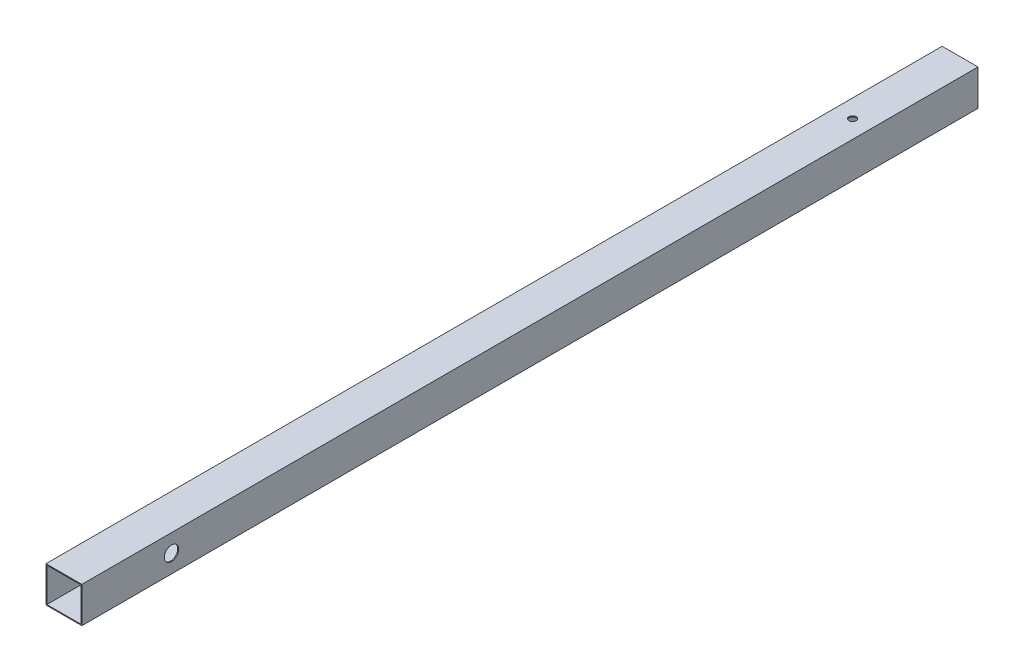
ISO-10303-21;
HEADER;
FILE_DESCRIPTION(('STEP AP214'),'2;1');
FILE_NAME('part.step','',(''),(''),'','','');
FILE_SCHEMA(('AUTOMOTIVE_DESIGN { 1 0 10303 214 1 1 1 1 }'));
ENDSEC;
DATA;
#1=APPLICATION_CONTEXT('core data for automotive mechanical design processes');
#2=APPLICATION_PROTOCOL_DEFINITION('international standard','automotive_design',2000,#1);
#3=PRODUCT_CONTEXT('',#1,'mechanical');
#4=PRODUCT('Part','Part','',(#3));
#5=PRODUCT_RELATED_PRODUCT_CATEGORY('part','',(#4));
#6=PRODUCT_DEFINITION_FORMATION('','',#4);
#7=PRODUCT_DEFINITION_CONTEXT('part definition',#1,'design');
#8=PRODUCT_DEFINITION('design','',#6,#7);
#9=PRODUCT_DEFINITION_SHAPE('','',#8);
#10=(LENGTH_UNIT() NAMED_UNIT(*) SI_UNIT(.MILLI.,.METRE.));
#11=(NAMED_UNIT(*) PLANE_ANGLE_UNIT() SI_UNIT($,.RADIAN.));
#12=(NAMED_UNIT(*) SI_UNIT($,.STERADIAN.) SOLID_ANGLE_UNIT());
#13=UNCERTAINTY_MEASURE_WITH_UNIT(LENGTH_MEASURE(1.E-05),#10,'distance_accuracy_value','');
#14=(GEOMETRIC_REPRESENTATION_CONTEXT(3) GLOBAL_UNCERTAINTY_ASSIGNED_CONTEXT((#13)) GLOBAL_UNIT_ASSIGNED_CONTEXT((#10,
#11,#12)) REPRESENTATION_CONTEXT('',''));
#15=CARTESIAN_POINT('',(0.,0.,0.));
#16=DIRECTION('',(0.,0.,1.));
#17=DIRECTION('',(1.,0.,0.));
#18=AXIS2_PLACEMENT_3D('',#15,#16,#17);
#19=CARTESIAN_POINT('',(10.,10.,500.));
#20=DIRECTION('',(-1.,0.,0.));
#21=DIRECTION('',(0.,-1.,0.));
#22=AXIS2_PLACEMENT_3D('',#19,#20,#21);
#23=PLANE('',#22);
#24=CARTESIAN_POINT('',(10.,0.,450.));
#25=DIRECTION('',(-1.,0.,0.));
#26=DIRECTION('',(0.,0.,1.));
#27=AXIS2_PLACEMENT_3D('',#24,#25,#26);
#28=CIRCLE('',#27,3.99999999999999);
#29=CARTESIAN_POINT('',(10.,0.,454.));
#30=VERTEX_POINT('',#29);
#31=EDGE_CURVE('E182',#30,#30,#28,.T.);
#32=ORIENTED_EDGE('',*,*,#31,.T.);
#33=EDGE_LOOP('',(#32));
#34=FACE_BOUND('',#33,.T.);
#35=DIRECTION('',(0.,1.,0.));
#36=VECTOR('',#35,1.);
#37=CARTESIAN_POINT('',(10.,10.,0.));
#38=LINE('',#37,#36);
#39=CARTESIAN_POINT('',(10.,-10.,0.));
#40=VERTEX_POINT('',#39);
#41=CARTESIAN_POINT('',(10.,10.,0.));
#42=VERTEX_POINT('',#41);
#43=EDGE_CURVE('E135',#40,#42,#38,.T.);
#44=ORIENTED_EDGE('',*,*,#43,.T.);
#45=DIRECTION('',(0.,0.,-1.));
#46=VECTOR('',#45,1.);
#47=CARTESIAN_POINT('',(10.,10.,500.));
#48=LINE('',#47,#46);
#49=CARTESIAN_POINT('',(10.,10.,500.));
#50=VERTEX_POINT('',#49);
#51=EDGE_CURVE('E11',#50,#42,#48,.T.);
#52=ORIENTED_EDGE('',*,*,#51,.F.);
#53=DIRECTION('',(0.,1.,0.));
#54=VECTOR('',#53,1.);
#55=CARTESIAN_POINT('',(10.,10.,500.));
#56=LINE('',#55,#54);
#57=CARTESIAN_POINT('',(10.,-10.,500.));
#58=VERTEX_POINT('',#57);
#59=EDGE_CURVE('E139',#58,#50,#56,.T.);
#60=ORIENTED_EDGE('',*,*,#59,.F.);
#61=DIRECTION('',(0.,0.,-1.));
#62=VECTOR('',#61,1.);
#63=CARTESIAN_POINT('',(10.,-10.,500.));
#64=LINE('',#63,#62);
#65=EDGE_CURVE('E149',#58,#40,#64,.T.);
#66=ORIENTED_EDGE('',*,*,#65,.T.);
#67=EDGE_LOOP('',(#44,#52,#60,#66));
#68=FACE_BOUND('',#67,.T.);
#69=ADVANCED_FACE('F33',(#34,#68),#23,.F.);
#70=CARTESIAN_POINT('',(-10.,10.,500.));
#71=DIRECTION('',(0.,-1.,0.));
#72=DIRECTION('',(0.,0.,-1.));
#73=AXIS2_PLACEMENT_3D('',#70,#71,#72);
#74=PLANE('',#73);
#75=CARTESIAN_POINT('',(0.,10.,60.));
#76=DIRECTION('',(0.,1.,0.));
#77=DIRECTION('',(0.,0.,1.));
#78=AXIS2_PLACEMENT_3D('',#75,#76,#77);
#79=CIRCLE('',#78,2.);
#80=CARTESIAN_POINT('',(0.,10.,62.));
#81=VERTEX_POINT('',#80);
#82=EDGE_CURVE('E170',#81,#81,#79,.T.);
#83=ORIENTED_EDGE('',*,*,#82,.F.);
#84=EDGE_LOOP('',(#83));
#85=FACE_BOUND('',#84,.T.);
#86=DIRECTION('',(-1.,0.,0.));
#87=VECTOR('',#86,1.);
#88=CARTESIAN_POINT('',(-10.,10.,0.));
#89=LINE('',#88,#87);
#90=CARTESIAN_POINT('',(-10.,10.,0.));
#91=VERTEX_POINT('',#90);
#92=EDGE_CURVE('E152',#42,#91,#89,.T.);
#93=ORIENTED_EDGE('',*,*,#92,.T.);
#94=DIRECTION('',(0.,0.,-1.));
#95=VECTOR('',#94,1.);
#96=CARTESIAN_POINT('',(-10.,10.,500.));
#97=LINE('',#96,#95);
#98=CARTESIAN_POINT('',(-10.,10.,500.));
#99=VERTEX_POINT('',#98);
#100=EDGE_CURVE('E41',#99,#91,#97,.T.);
#101=ORIENTED_EDGE('',*,*,#100,.F.);
#102=DIRECTION('',(-1.,0.,0.));
#103=VECTOR('',#102,1.);
#104=CARTESIAN_POINT('',(-10.,10.,500.));
#105=LINE('',#104,#103);
#106=EDGE_CURVE('E142',#50,#99,#105,.T.);
#107=ORIENTED_EDGE('',*,*,#106,.F.);
#108=ORIENTED_EDGE('',*,*,#51,.T.);
#109=EDGE_LOOP('',(#93,#101,#107,#108));
#110=FACE_BOUND('',#109,.T.);
#111=ADVANCED_FACE('F206',(#85,#110),#74,.F.);
#112=CARTESIAN_POINT('',(-10.,10.,500.));
#113=DIRECTION('',(1.,0.,0.));
#114=DIRECTION('',(0.,0.,-1.));
#115=AXIS2_PLACEMENT_3D('',#112,#113,#114);
#116=PLANE('',#115);
#117=CARTESIAN_POINT('',(-10.,0.,450.));
#118=DIRECTION('',(-1.,0.,0.));
#119=DIRECTION('',(0.,0.,1.));
#120=AXIS2_PLACEMENT_3D('',#117,#118,#119);
#121=CIRCLE('',#120,3.99999999999999);
#122=CARTESIAN_POINT('',(-10.,0.,454.));
#123=VERTEX_POINT('',#122);
#124=EDGE_CURVE('E179',#123,#123,#121,.T.);
#125=ORIENTED_EDGE('',*,*,#124,.F.);
#126=EDGE_LOOP('',(#125));
#127=FACE_BOUND('',#126,.T.);
#128=DIRECTION('',(0.,-1.,0.));
#129=VECTOR('',#128,1.);
#130=CARTESIAN_POINT('',(-10.,10.,0.));
#131=LINE('',#130,#129);
#132=CARTESIAN_POINT('',(-10.,-10.,0.));
#133=VERTEX_POINT('',#132);
#134=EDGE_CURVE('E154',#91,#133,#131,.T.);
#135=ORIENTED_EDGE('',*,*,#134,.T.);
#136=DIRECTION('',(0.,0.,-1.));
#137=VECTOR('',#136,1.);
#138=CARTESIAN_POINT('',(-10.,-10.,500.));
#139=LINE('',#138,#137);
#140=CARTESIAN_POINT('',(-10.,-10.,500.));
#141=VERTEX_POINT('',#140);
#142=EDGE_CURVE('E159',#141,#133,#139,.T.);
#143=ORIENTED_EDGE('',*,*,#142,.F.);
#144=DIRECTION('',(0.,-1.,0.));
#145=VECTOR('',#144,1.);
#146=CARTESIAN_POINT('',(-10.,10.,500.));
#147=LINE('',#146,#145);
#148=EDGE_CURVE('E145',#99,#141,#147,.T.);
#149=ORIENTED_EDGE('',*,*,#148,.F.);
#150=ORIENTED_EDGE('',*,*,#100,.T.);
#151=EDGE_LOOP('',(#135,#143,#149,#150));
#152=FACE_BOUND('',#151,.T.);
#153=ADVANCED_FACE('F210',(#127,#152),#116,.F.);
#154=CARTESIAN_POINT('',(-10.,-10.,500.));
#155=DIRECTION('',(0.,1.,0.));
#156=DIRECTION('',(0.,0.,1.));
#157=AXIS2_PLACEMENT_3D('',#154,#155,#156);
#158=PLANE('',#157);
#159=CARTESIAN_POINT('',(0.,-10.,60.));
#160=DIRECTION('',(0.,1.,0.));
#161=DIRECTION('',(0.,0.,1.));
#162=AXIS2_PLACEMENT_3D('',#159,#160,#161);
#163=CIRCLE('',#162,2.);
#164=CARTESIAN_POINT('',(0.,-10.,62.));
#165=VERTEX_POINT('',#164);
#166=EDGE_CURVE('E165',#165,#165,#163,.T.);
#167=ORIENTED_EDGE('',*,*,#166,.T.);
#168=EDGE_LOOP('',(#167));
#169=FACE_BOUND('',#168,.T.);
#170=DIRECTION('',(1.,0.,0.));
#171=VECTOR('',#170,1.);
#172=CARTESIAN_POINT('',(-10.,-10.,0.));
#173=LINE('',#172,#171);
#174=EDGE_CURVE('E143',#133,#40,#173,.T.);
#175=ORIENTED_EDGE('',*,*,#174,.T.);
#176=ORIENTED_EDGE('',*,*,#65,.F.);
#177=DIRECTION('',(1.,0.,0.));
#178=VECTOR('',#177,1.);
#179=CARTESIAN_POINT('',(-10.,-10.,500.));
#180=LINE('',#179,#178);
#181=EDGE_CURVE('E147',#141,#58,#180,.T.);
#182=ORIENTED_EDGE('',*,*,#181,.F.);
#183=ORIENTED_EDGE('',*,*,#142,.T.);
#184=EDGE_LOOP('',(#175,#176,#182,#183));
#185=FACE_BOUND('',#184,.T.);
#186=ADVANCED_FACE('F227',(#169,#185),#158,.F.);
#187=CARTESIAN_POINT('',(0.,0.,500.));
#188=DIRECTION('',(0.,0.,1.));
#189=DIRECTION('',(1.,0.,0.));
#190=AXIS2_PLACEMENT_3D('',#187,#188,#189);
#191=PLANE('',#190);
#192=DIRECTION('',(0.,1.,0.));
#193=VECTOR('',#192,1.);
#194=CARTESIAN_POINT('',(-9.5,9.5,500.));
#195=LINE('',#194,#193);
#196=CARTESIAN_POINT('',(-9.5,-9.5,500.));
#197=VERTEX_POINT('',#196);
#198=CARTESIAN_POINT('',(-9.5,9.5,500.));
#199=VERTEX_POINT('',#198);
#200=EDGE_CURVE('E101',#197,#199,#195,.T.);
#201=ORIENTED_EDGE('',*,*,#200,.T.);
#202=DIRECTION('',(1.,0.,0.));
#203=VECTOR('',#202,1.);
#204=CARTESIAN_POINT('',(9.5,9.5,500.));
#205=LINE('',#204,#203);
#206=CARTESIAN_POINT('',(9.5,9.5,500.));
#207=VERTEX_POINT('',#206);
#208=EDGE_CURVE('E110',#199,#207,#205,.T.);
#209=ORIENTED_EDGE('',*,*,#208,.T.);
#210=DIRECTION('',(0.,-1.,0.));
#211=VECTOR('',#210,1.);
#212=CARTESIAN_POINT('',(9.5,9.5,500.));
#213=LINE('',#212,#211);
#214=CARTESIAN_POINT('',(9.5,-9.5,500.));
#215=VERTEX_POINT('',#214);
#216=EDGE_CURVE('E49',#207,#215,#213,.T.);
#217=ORIENTED_EDGE('',*,*,#216,.T.);
#218=DIRECTION('',(-1.,0.,0.));
#219=VECTOR('',#218,1.);
#220=CARTESIAN_POINT('',(9.5,-9.5,500.));
#221=LINE('',#220,#219);
#222=EDGE_CURVE('E107',#215,#197,#221,.T.);
#223=ORIENTED_EDGE('',*,*,#222,.T.);
#224=EDGE_LOOP('',(#201,#209,#217,#223));
#225=FACE_BOUND('',#224,.T.);
#226=ORIENTED_EDGE('',*,*,#59,.T.);
#227=ORIENTED_EDGE('',*,*,#106,.T.);
#228=ORIENTED_EDGE('',*,*,#148,.T.);
#229=ORIENTED_EDGE('',*,*,#181,.T.);
#230=EDGE_LOOP('',(#226,#227,#228,#229));
#231=FACE_BOUND('',#230,.T.);
#232=ADVANCED_FACE('F114',(#225,#231),#191,.T.);
#233=CARTESIAN_POINT('',(0.,0.,0.));
#234=DIRECTION('',(0.,0.,1.));
#235=DIRECTION('',(1.,0.,0.));
#236=AXIS2_PLACEMENT_3D('',#233,#234,#235);
#237=PLANE('',#236);
#238=DIRECTION('',(1.,0.,0.));
#239=VECTOR('',#238,1.);
#240=CARTESIAN_POINT('',(9.5,9.5,0.));
#241=LINE('',#240,#239);
#242=CARTESIAN_POINT('',(-9.5,9.5,0.));
#243=VERTEX_POINT('',#242);
#244=CARTESIAN_POINT('',(9.5,9.5,0.));
#245=VERTEX_POINT('',#244);
#246=EDGE_CURVE('E129',#243,#245,#241,.T.);
#247=ORIENTED_EDGE('',*,*,#246,.F.);
#248=DIRECTION('',(0.,1.,0.));
#249=VECTOR('',#248,1.);
#250=CARTESIAN_POINT('',(-9.5,9.5,0.));
#251=LINE('',#250,#249);
#252=CARTESIAN_POINT('',(-9.5,-9.5,0.));
#253=VERTEX_POINT('',#252);
#254=EDGE_CURVE('E57',#253,#243,#251,.T.);
#255=ORIENTED_EDGE('',*,*,#254,.F.);
#256=DIRECTION('',(-1.,0.,0.));
#257=VECTOR('',#256,1.);
#258=CARTESIAN_POINT('',(9.5,-9.5,0.));
#259=LINE('',#258,#257);
#260=CARTESIAN_POINT('',(9.5,-9.5,0.));
#261=VERTEX_POINT('',#260);
#262=EDGE_CURVE('E117',#261,#253,#259,.T.);
#263=ORIENTED_EDGE('',*,*,#262,.F.);
#264=DIRECTION('',(0.,-1.,0.));
#265=VECTOR('',#264,1.);
#266=CARTESIAN_POINT('',(9.5,9.5,0.));
#267=LINE('',#266,#265);
#268=EDGE_CURVE('E120',#245,#261,#267,.T.);
#269=ORIENTED_EDGE('',*,*,#268,.F.);
#270=EDGE_LOOP('',(#247,#255,#263,#269));
#271=FACE_BOUND('',#270,.T.);
#272=ORIENTED_EDGE('',*,*,#43,.F.);
#273=ORIENTED_EDGE('',*,*,#174,.F.);
#274=ORIENTED_EDGE('',*,*,#134,.F.);
#275=ORIENTED_EDGE('',*,*,#92,.F.);
#276=EDGE_LOOP('',(#272,#273,#274,#275));
#277=FACE_BOUND('',#276,.T.);
#278=ADVANCED_FACE('F219',(#271,#277),#237,.F.);
#279=CARTESIAN_POINT('',(-9.5,9.5,500.));
#280=DIRECTION('',(-1.,0.,0.));
#281=DIRECTION('',(0.,-1.,0.));
#282=AXIS2_PLACEMENT_3D('',#279,#280,#281);
#283=PLANE('',#282);
#284=CARTESIAN_POINT('',(-9.5,0.,450.));
#285=DIRECTION('',(-1.,0.,0.));
#286=DIRECTION('',(0.,-1.,0.));
#287=AXIS2_PLACEMENT_3D('',#284,#285,#286);
#288=CIRCLE('',#287,3.99999999999999);
#289=CARTESIAN_POINT('',(-9.5,-3.99999999999999,450.));
#290=VERTEX_POINT('',#289);
#291=EDGE_CURVE('E175',#290,#290,#288,.T.);
#292=ORIENTED_EDGE('',*,*,#291,.T.);
#293=EDGE_LOOP('',(#292));
#294=FACE_BOUND('',#293,.T.);
#295=ORIENTED_EDGE('',*,*,#254,.T.);
#296=DIRECTION('',(0.,0.,-1.));
#297=VECTOR('',#296,1.);
#298=CARTESIAN_POINT('',(-9.5,9.5,500.));
#299=LINE('',#298,#297);
#300=EDGE_CURVE('E97',#199,#243,#299,.T.);
#301=ORIENTED_EDGE('',*,*,#300,.F.);
#302=ORIENTED_EDGE('',*,*,#200,.F.);
#303=DIRECTION('',(0.,0.,-1.));
#304=VECTOR('',#303,1.);
#305=CARTESIAN_POINT('',(-9.5,-9.5,500.));
#306=LINE('',#305,#304);
#307=EDGE_CURVE('E133',#197,#253,#306,.T.);
#308=ORIENTED_EDGE('',*,*,#307,.T.);
#309=EDGE_LOOP('',(#295,#301,#302,#308));
#310=FACE_BOUND('',#309,.T.);
#311=ADVANCED_FACE('F99',(#294,#310),#283,.F.);
#312=CARTESIAN_POINT('',(9.5,-9.5,500.));
#313=DIRECTION('',(0.,-1.,0.));
#314=DIRECTION('',(0.,0.,-1.));
#315=AXIS2_PLACEMENT_3D('',#312,#313,#314);
#316=PLANE('',#315);
#317=CARTESIAN_POINT('',(0.,-9.5,60.));
#318=DIRECTION('',(0.,-1.,0.));
#319=DIRECTION('',(0.,0.,-1.));
#320=AXIS2_PLACEMENT_3D('',#317,#318,#319);
#321=CIRCLE('',#320,2.);
#322=CARTESIAN_POINT('',(0.,-9.5,58.));
#323=VERTEX_POINT('',#322);
#324=EDGE_CURVE('E123',#323,#323,#321,.T.);
#325=ORIENTED_EDGE('',*,*,#324,.T.);
#326=EDGE_LOOP('',(#325));
#327=FACE_BOUND('',#326,.T.);
#328=ORIENTED_EDGE('',*,*,#262,.T.);
#329=ORIENTED_EDGE('',*,*,#307,.F.);
#330=ORIENTED_EDGE('',*,*,#222,.F.);
#331=DIRECTION('',(0.,0.,-1.));
#332=VECTOR('',#331,1.);
#333=CARTESIAN_POINT('',(9.5,-9.5,500.));
#334=LINE('',#333,#332);
#335=EDGE_CURVE('E136',#215,#261,#334,.T.);
#336=ORIENTED_EDGE('',*,*,#335,.T.);
#337=EDGE_LOOP('',(#328,#329,#330,#336));
#338=FACE_BOUND('',#337,.T.);
#339=ADVANCED_FACE('F245',(#327,#338),#316,.F.);
#340=CARTESIAN_POINT('',(9.5,9.5,500.));
#341=DIRECTION('',(1.,0.,0.));
#342=DIRECTION('',(0.,1.,0.));
#343=AXIS2_PLACEMENT_3D('',#340,#341,#342);
#344=PLANE('',#343);
#345=CARTESIAN_POINT('',(9.5,0.,450.));
#346=DIRECTION('',(1.,0.,0.));
#347=DIRECTION('',(0.,1.,0.));
#348=AXIS2_PLACEMENT_3D('',#345,#346,#347);
#349=CIRCLE('',#348,3.99999999999999);
#350=CARTESIAN_POINT('',(9.5,3.99999999999999,450.));
#351=VERTEX_POINT('',#350);
#352=EDGE_CURVE('E36',#351,#351,#349,.T.);
#353=ORIENTED_EDGE('',*,*,#352,.T.);
#354=EDGE_LOOP('',(#353));
#355=FACE_BOUND('',#354,.T.);
#356=ORIENTED_EDGE('',*,*,#268,.T.);
#357=ORIENTED_EDGE('',*,*,#335,.F.);
#358=ORIENTED_EDGE('',*,*,#216,.F.);
#359=DIRECTION('',(0.,0.,-1.));
#360=VECTOR('',#359,1.);
#361=CARTESIAN_POINT('',(9.5,9.5,500.));
#362=LINE('',#361,#360);
#363=EDGE_CURVE('E106',#207,#245,#362,.T.);
#364=ORIENTED_EDGE('',*,*,#363,.T.);
#365=EDGE_LOOP('',(#356,#357,#358,#364));
#366=FACE_BOUND('',#365,.T.);
#367=ADVANCED_FACE('F189',(#355,#366),#344,.F.);
#368=CARTESIAN_POINT('',(9.5,9.5,500.));
#369=DIRECTION('',(0.,1.,0.));
#370=DIRECTION('',(0.,0.,1.));
#371=AXIS2_PLACEMENT_3D('',#368,#369,#370);
#372=PLANE('',#371);
#373=CARTESIAN_POINT('',(0.,9.50000000000001,60.));
#374=DIRECTION('',(0.,1.,0.));
#375=DIRECTION('',(0.,0.,1.));
#376=AXIS2_PLACEMENT_3D('',#373,#374,#375);
#377=CIRCLE('',#376,2.);
#378=CARTESIAN_POINT('',(0.,9.50000000000001,62.));
#379=VERTEX_POINT('',#378);
#380=EDGE_CURVE('E163',#379,#379,#377,.T.);
#381=ORIENTED_EDGE('',*,*,#380,.T.);
#382=EDGE_LOOP('',(#381));
#383=FACE_BOUND('',#382,.T.);
#384=ORIENTED_EDGE('',*,*,#246,.T.);
#385=ORIENTED_EDGE('',*,*,#363,.F.);
#386=ORIENTED_EDGE('',*,*,#208,.F.);
#387=ORIENTED_EDGE('',*,*,#300,.T.);
#388=EDGE_LOOP('',(#384,#385,#386,#387));
#389=FACE_BOUND('',#388,.T.);
#390=ADVANCED_FACE('F111',(#383,#389),#372,.F.);
#391=CARTESIAN_POINT('',(0.,-10.,60.));
#392=DIRECTION('',(0.,1.,0.));
#393=DIRECTION('',(0.,0.,1.));
#394=AXIS2_PLACEMENT_3D('',#391,#392,#393);
#395=CYLINDRICAL_SURFACE('',#394,2.);
#396=ORIENTED_EDGE('',*,*,#82,.T.);
#397=EDGE_LOOP('',(#396));
#398=FACE_BOUND('',#397,.T.);
#399=ORIENTED_EDGE('',*,*,#380,.F.);
#400=EDGE_LOOP('',(#399));
#401=FACE_BOUND('',#400,.T.);
#402=ADVANCED_FACE('F202',(#398,#401),#395,.F.);
#403=ORIENTED_EDGE('',*,*,#166,.F.);
#404=EDGE_LOOP('',(#403));
#405=FACE_BOUND('',#404,.T.);
#406=ORIENTED_EDGE('',*,*,#324,.F.);
#407=EDGE_LOOP('',(#406));
#408=FACE_BOUND('',#407,.T.);
#409=ADVANCED_FACE('F194',(#405,#408),#395,.F.);
#410=CARTESIAN_POINT('',(10.,0.,450.));
#411=DIRECTION('',(-1.,0.,0.));
#412=DIRECTION('',(0.,0.,1.));
#413=AXIS2_PLACEMENT_3D('',#410,#411,#412);
#414=CYLINDRICAL_SURFACE('',#413,3.99999999999999);
#415=ORIENTED_EDGE('',*,*,#31,.F.);
#416=EDGE_LOOP('',(#415));
#417=FACE_BOUND('',#416,.T.);
#418=ORIENTED_EDGE('',*,*,#352,.F.);
#419=EDGE_LOOP('',(#418));
#420=FACE_BOUND('',#419,.T.);
#421=ADVANCED_FACE('F191',(#417,#420),#414,.F.);
#422=ORIENTED_EDGE('',*,*,#124,.T.);
#423=EDGE_LOOP('',(#422));
#424=FACE_BOUND('',#423,.T.);
#425=ORIENTED_EDGE('',*,*,#291,.F.);
#426=EDGE_LOOP('',(#425));
#427=FACE_BOUND('',#426,.T.);
#428=ADVANCED_FACE('F193',(#424,#427),#414,.F.);
#429=CLOSED_SHELL('',(#69,#111,#153,#186,#232,#278,#311,#339,#367,#390,#402,#409,#421,#428));
#430=MANIFOLD_SOLID_BREP('B2',#429);
#431=ADVANCED_BREP_SHAPE_REPRESENTATION('',(#18,#430),#14);
#432=SHAPE_DEFINITION_REPRESENTATION(#9,#431);
ENDSEC;
END-ISO-10303-21;
